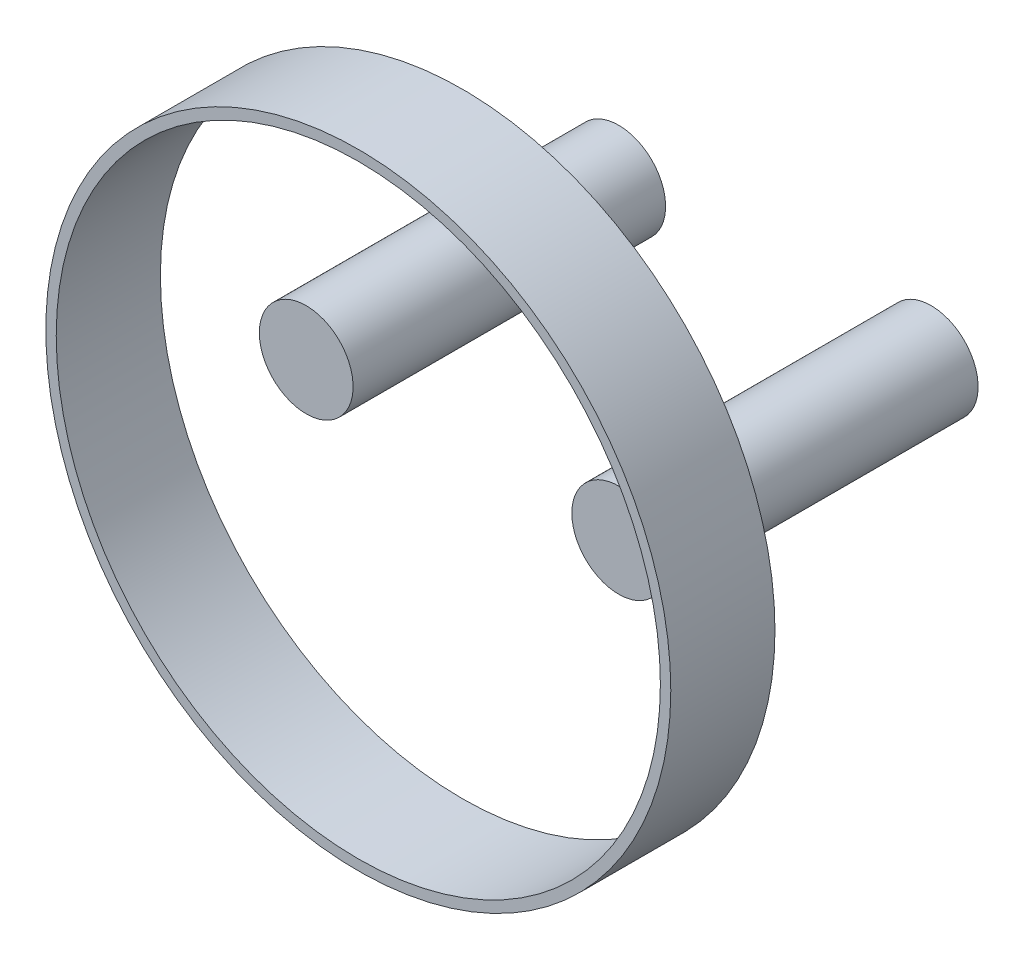
ISO-10303-21;
HEADER;
FILE_DESCRIPTION(('STEP AP214'),'2;1');
FILE_NAME('part.step','',(''),(''),'','','');
FILE_SCHEMA(('AUTOMOTIVE_DESIGN { 1 0 10303 214 1 1 1 1 }'));
ENDSEC;
DATA;
#1=APPLICATION_CONTEXT('core data for automotive mechanical design processes');
#2=APPLICATION_PROTOCOL_DEFINITION('international standard','automotive_design',2000,#1);
#3=PRODUCT_CONTEXT('',#1,'mechanical');
#4=PRODUCT('Part','Part','',(#3));
#5=PRODUCT_RELATED_PRODUCT_CATEGORY('part','',(#4));
#6=PRODUCT_DEFINITION_FORMATION('','',#4);
#7=PRODUCT_DEFINITION_CONTEXT('part definition',#1,'design');
#8=PRODUCT_DEFINITION('design','',#6,#7);
#9=PRODUCT_DEFINITION_SHAPE('','',#8);
#10=(LENGTH_UNIT() NAMED_UNIT(*) SI_UNIT(.MILLI.,.METRE.));
#11=(NAMED_UNIT(*) PLANE_ANGLE_UNIT() SI_UNIT($,.RADIAN.));
#12=(NAMED_UNIT(*) SI_UNIT($,.STERADIAN.) SOLID_ANGLE_UNIT());
#13=UNCERTAINTY_MEASURE_WITH_UNIT(LENGTH_MEASURE(1.E-05),#10,'distance_accuracy_value','');
#14=(GEOMETRIC_REPRESENTATION_CONTEXT(3) GLOBAL_UNCERTAINTY_ASSIGNED_CONTEXT((#13)) GLOBAL_UNIT_ASSIGNED_CONTEXT((#10,
#11,#12)) REPRESENTATION_CONTEXT('',''));
#15=CARTESIAN_POINT('',(0.,0.,0.));
#16=DIRECTION('',(0.,0.,1.));
#17=DIRECTION('',(1.,0.,0.));
#18=AXIS2_PLACEMENT_3D('',#15,#16,#17);
#19=CARTESIAN_POINT('',(0.,0.,0.25));
#20=DIRECTION('',(0.,0.,1.));
#21=DIRECTION('',(1.,0.,0.));
#22=AXIS2_PLACEMENT_3D('',#19,#20,#21);
#23=CYLINDRICAL_SURFACE('',#22,1.45);
#24=CARTESIAN_POINT('',(0.,0.,0.));
#25=DIRECTION('',(0.,0.,1.));
#26=DIRECTION('',(1.,0.,0.));
#27=AXIS2_PLACEMENT_3D('',#24,#25,#26);
#28=CIRCLE('',#27,1.45);
#29=CARTESIAN_POINT('',(1.45,0.,0.));
#30=VERTEX_POINT('',#29);
#31=EDGE_CURVE('P0_E18',#30,#30,#28,.T.);
#32=ORIENTED_EDGE('',*,*,#31,.F.);
#33=EDGE_LOOP('',(#32));
#34=FACE_BOUND('',#33,.T.);
#35=CARTESIAN_POINT('',(0.,0.,0.5));
#36=DIRECTION('',(0.,0.,1.));
#37=DIRECTION('',(1.,0.,0.));
#38=AXIS2_PLACEMENT_3D('',#35,#36,#37);
#39=CIRCLE('',#38,1.45);
#40=CARTESIAN_POINT('',(1.45,0.,0.5));
#41=VERTEX_POINT('',#40);
#42=EDGE_CURVE('P0_E27',#41,#41,#39,.F.);
#43=ORIENTED_EDGE('',*,*,#42,.F.);
#44=EDGE_LOOP('',(#43));
#45=FACE_BOUND('',#44,.T.);
#46=ADVANCED_FACE('P0_F15',(#34,#45),#23,.F.);
#47=CARTESIAN_POINT('',(1.5,0.,0.));
#48=DIRECTION('',(0.,0.,-1.));
#49=DIRECTION('',(-1.,0.,0.));
#50=AXIS2_PLACEMENT_3D('',#47,#48,#49);
#51=PLANE('',#50);
#52=CARTESIAN_POINT('',(0.,0.,0.));
#53=DIRECTION('',(0.,0.,1.));
#54=DIRECTION('',(1.,0.,0.));
#55=AXIS2_PLACEMENT_3D('',#52,#53,#54);
#56=CIRCLE('',#55,1.5);
#57=CARTESIAN_POINT('',(1.5,0.,0.));
#58=VERTEX_POINT('',#57);
#59=EDGE_CURVE('P0_E22',#58,#58,#56,.T.);
#60=ORIENTED_EDGE('',*,*,#59,.F.);
#61=EDGE_LOOP('',(#60));
#62=FACE_BOUND('',#61,.T.);
#63=ORIENTED_EDGE('',*,*,#31,.T.);
#64=EDGE_LOOP('',(#63));
#65=FACE_BOUND('',#64,.T.);
#66=ADVANCED_FACE('P0_F35',(#62,#65),#51,.T.);
#67=CARTESIAN_POINT('',(1.45,0.,0.5));
#68=DIRECTION('',(0.,0.,1.));
#69=DIRECTION('',(1.,0.,0.));
#70=AXIS2_PLACEMENT_3D('',#67,#68,#69);
#71=PLANE('',#70);
#72=CARTESIAN_POINT('',(0.,0.,0.5));
#73=DIRECTION('',(0.,0.,1.));
#74=DIRECTION('',(1.,0.,0.));
#75=AXIS2_PLACEMENT_3D('',#72,#73,#74);
#76=CIRCLE('',#75,1.5);
#77=CARTESIAN_POINT('',(1.5,0.,0.5));
#78=VERTEX_POINT('',#77);
#79=EDGE_CURVE('P0_E10',#78,#78,#76,.F.);
#80=ORIENTED_EDGE('',*,*,#79,.F.);
#81=EDGE_LOOP('',(#80));
#82=FACE_BOUND('',#81,.T.);
#83=ORIENTED_EDGE('',*,*,#42,.T.);
#84=EDGE_LOOP('',(#83));
#85=FACE_BOUND('',#84,.T.);
#86=ADVANCED_FACE('P0_F43',(#82,#85),#71,.T.);
#87=CARTESIAN_POINT('',(0.,0.,0.25));
#88=DIRECTION('',(0.,0.,1.));
#89=DIRECTION('',(1.,0.,0.));
#90=AXIS2_PLACEMENT_3D('',#87,#88,#89);
#91=CYLINDRICAL_SURFACE('',#90,1.5);
#92=ORIENTED_EDGE('',*,*,#59,.T.);
#93=EDGE_LOOP('',(#92));
#94=FACE_BOUND('',#93,.T.);
#95=ORIENTED_EDGE('',*,*,#79,.T.);
#96=EDGE_LOOP('',(#95));
#97=FACE_BOUND('',#96,.T.);
#98=ADVANCED_FACE('P0_F45',(#94,#97),#91,.T.);
#99=CLOSED_SHELL('',(#46,#66,#86,#98));
#100=MANIFOLD_SOLID_BREP('P0_B1',#99);
#101=CARTESIAN_POINT('',(-0.75,0.,0.));
#102=DIRECTION('',(0.,0.,1.));
#103=DIRECTION('',(1.,0.,0.));
#104=AXIS2_PLACEMENT_3D('',#101,#102,#103);
#105=PLANE('',#104);
#106=CARTESIAN_POINT('',(-0.75,0.,0.));
#107=DIRECTION('',(0.,0.,-1.));
#108=DIRECTION('',(-1.,0.,0.));
#109=AXIS2_PLACEMENT_3D('',#106,#107,#108);
#110=CIRCLE('',#109,0.225);
#111=CARTESIAN_POINT('',(-0.975,0.,0.));
#112=VERTEX_POINT('',#111);
#113=EDGE_CURVE('P1_E18',#112,#112,#110,.T.);
#114=ORIENTED_EDGE('',*,*,#113,.F.);
#115=EDGE_LOOP('',(#114));
#116=FACE_BOUND('',#115,.T.);
#117=ADVANCED_FACE('P1_F15',(#116),#105,.T.);
#118=CARTESIAN_POINT('',(-0.75,0.,-1.5));
#119=DIRECTION('',(0.,0.,1.));
#120=DIRECTION('',(1.,0.,0.));
#121=AXIS2_PLACEMENT_3D('',#118,#119,#120);
#122=PLANE('',#121);
#123=CARTESIAN_POINT('',(-0.75,0.,-1.5));
#124=DIRECTION('',(0.,0.,-1.));
#125=DIRECTION('',(-1.,0.,0.));
#126=AXIS2_PLACEMENT_3D('',#123,#124,#125);
#127=CIRCLE('',#126,0.225);
#128=CARTESIAN_POINT('',(-0.975,0.,-1.5));
#129=VERTEX_POINT('',#128);
#130=EDGE_CURVE('P1_E10',#129,#129,#127,.F.);
#131=ORIENTED_EDGE('',*,*,#130,.F.);
#132=EDGE_LOOP('',(#131));
#133=FACE_BOUND('',#132,.T.);
#134=ADVANCED_FACE('P1_F30',(#133),#122,.F.);
#135=CARTESIAN_POINT('',(-0.75,0.,0.));
#136=DIRECTION('',(0.,0.,-1.));
#137=DIRECTION('',(-1.,0.,0.));
#138=AXIS2_PLACEMENT_3D('',#135,#136,#137);
#139=CYLINDRICAL_SURFACE('',#138,0.225);
#140=ORIENTED_EDGE('',*,*,#130,.T.);
#141=EDGE_LOOP('',(#140));
#142=FACE_BOUND('',#141,.T.);
#143=ORIENTED_EDGE('',*,*,#113,.T.);
#144=EDGE_LOOP('',(#143));
#145=FACE_BOUND('',#144,.T.);
#146=ADVANCED_FACE('P1_F27',(#142,#145),#139,.T.);
#147=CLOSED_SHELL('',(#117,#134,#146));
#148=MANIFOLD_SOLID_BREP('P1_B1',#147);
#149=CARTESIAN_POINT('',(0.75,0.,0.));
#150=DIRECTION('',(0.,0.,1.));
#151=DIRECTION('',(1.,0.,0.));
#152=AXIS2_PLACEMENT_3D('',#149,#150,#151);
#153=PLANE('',#152);
#154=CARTESIAN_POINT('',(0.75,0.,0.));
#155=DIRECTION('',(0.,0.,-1.));
#156=DIRECTION('',(-1.,0.,0.));
#157=AXIS2_PLACEMENT_3D('',#154,#155,#156);
#158=CIRCLE('',#157,0.225);
#159=CARTESIAN_POINT('',(0.525,0.,0.));
#160=VERTEX_POINT('',#159);
#161=EDGE_CURVE('P2_E18',#160,#160,#158,.T.);
#162=ORIENTED_EDGE('',*,*,#161,.F.);
#163=EDGE_LOOP('',(#162));
#164=FACE_BOUND('',#163,.T.);
#165=ADVANCED_FACE('P2_F15',(#164),#153,.T.);
#166=CARTESIAN_POINT('',(0.75,0.,-1.5));
#167=DIRECTION('',(0.,0.,1.));
#168=DIRECTION('',(1.,0.,0.));
#169=AXIS2_PLACEMENT_3D('',#166,#167,#168);
#170=PLANE('',#169);
#171=CARTESIAN_POINT('',(0.75,0.,-1.5));
#172=DIRECTION('',(0.,0.,-1.));
#173=DIRECTION('',(-1.,0.,0.));
#174=AXIS2_PLACEMENT_3D('',#171,#172,#173);
#175=CIRCLE('',#174,0.225);
#176=CARTESIAN_POINT('',(0.525,0.,-1.5));
#177=VERTEX_POINT('',#176);
#178=EDGE_CURVE('P2_E10',#177,#177,#175,.F.);
#179=ORIENTED_EDGE('',*,*,#178,.F.);
#180=EDGE_LOOP('',(#179));
#181=FACE_BOUND('',#180,.T.);
#182=ADVANCED_FACE('P2_F30',(#181),#170,.F.);
#183=CARTESIAN_POINT('',(0.75,0.,0.));
#184=DIRECTION('',(0.,0.,-1.));
#185=DIRECTION('',(-1.,0.,0.));
#186=AXIS2_PLACEMENT_3D('',#183,#184,#185);
#187=CYLINDRICAL_SURFACE('',#186,0.225);
#188=ORIENTED_EDGE('',*,*,#178,.T.);
#189=EDGE_LOOP('',(#188));
#190=FACE_BOUND('',#189,.T.);
#191=ORIENTED_EDGE('',*,*,#161,.T.);
#192=EDGE_LOOP('',(#191));
#193=FACE_BOUND('',#192,.T.);
#194=ADVANCED_FACE('P2_F27',(#190,#193),#187,.T.);
#195=CLOSED_SHELL('',(#165,#182,#194));
#196=MANIFOLD_SOLID_BREP('P2_B1',#195);
#197=ADVANCED_BREP_SHAPE_REPRESENTATION('',(#18,#100,#148,#196),#14);
#198=SHAPE_DEFINITION_REPRESENTATION(#9,#197);
ENDSEC;
END-ISO-10303-21;
